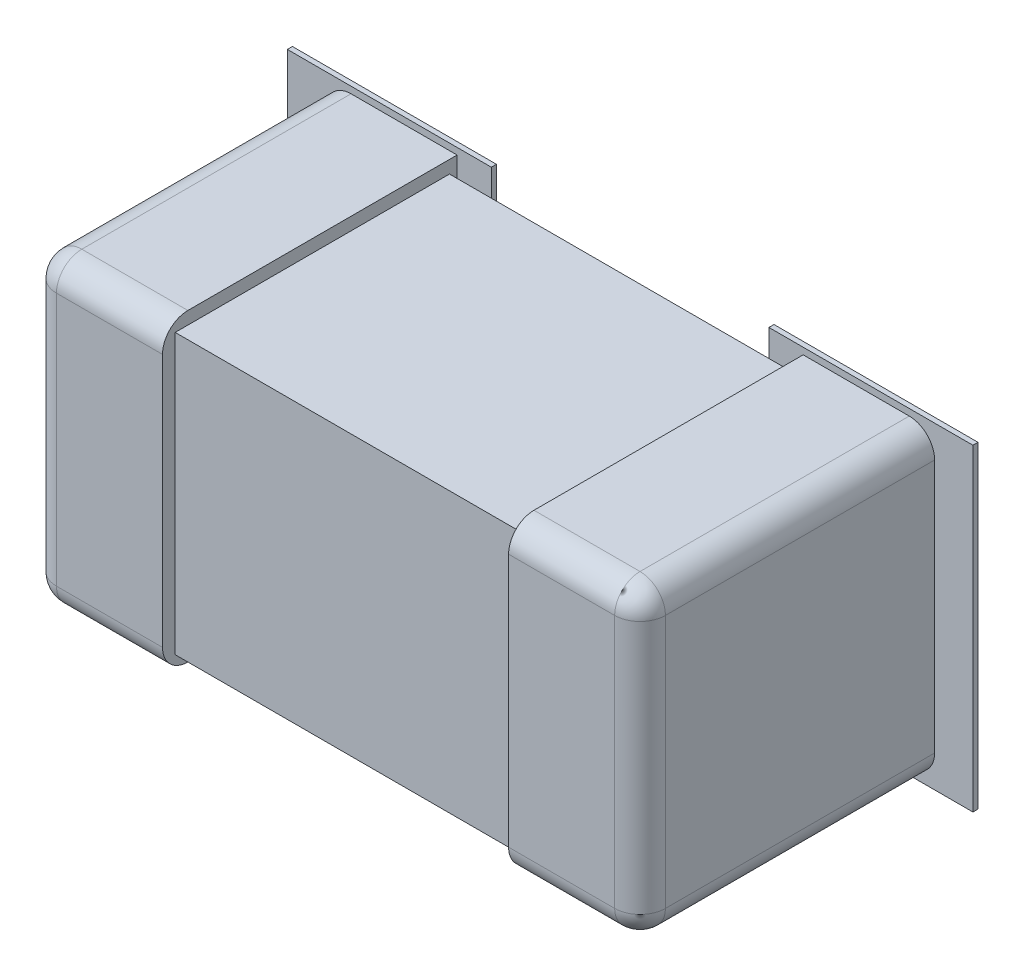
ISO-10303-21;
HEADER;
FILE_DESCRIPTION(('STEP AP214'),'2;1');
FILE_NAME('part.step','',(''),(''),'','','');
FILE_SCHEMA(('AUTOMOTIVE_DESIGN { 1 0 10303 214 1 1 1 1 }'));
ENDSEC;
DATA;
#1=APPLICATION_CONTEXT('core data for automotive mechanical design processes');
#2=APPLICATION_PROTOCOL_DEFINITION('international standard','automotive_design',2000,#1);
#3=PRODUCT_CONTEXT('',#1,'mechanical');
#4=PRODUCT('Part','Part','',(#3));
#5=PRODUCT_RELATED_PRODUCT_CATEGORY('part','',(#4));
#6=PRODUCT_DEFINITION_FORMATION('','',#4);
#7=PRODUCT_DEFINITION_CONTEXT('part definition',#1,'design');
#8=PRODUCT_DEFINITION('design','',#6,#7);
#9=PRODUCT_DEFINITION_SHAPE('','',#8);
#10=(LENGTH_UNIT() NAMED_UNIT(*) SI_UNIT(.MILLI.,.METRE.));
#11=(NAMED_UNIT(*) PLANE_ANGLE_UNIT() SI_UNIT($,.RADIAN.));
#12=(NAMED_UNIT(*) SI_UNIT($,.STERADIAN.) SOLID_ANGLE_UNIT());
#13=UNCERTAINTY_MEASURE_WITH_UNIT(LENGTH_MEASURE(1.E-05),#10,'distance_accuracy_value','');
#14=(GEOMETRIC_REPRESENTATION_CONTEXT(3) GLOBAL_UNCERTAINTY_ASSIGNED_CONTEXT((#13)) GLOBAL_UNIT_ASSIGNED_CONTEXT((#10,
#11,#12)) REPRESENTATION_CONTEXT('',''));
#15=CARTESIAN_POINT('',(0.,0.,0.));
#16=DIRECTION('',(0.,0.,1.));
#17=DIRECTION('',(1.,0.,0.));
#18=AXIS2_PLACEMENT_3D('',#15,#16,#17);
#19=CARTESIAN_POINT('',(0.,0.,0.0762));
#20=DIRECTION('',(0.,0.,1.));
#21=DIRECTION('',(1.,0.,0.));
#22=AXIS2_PLACEMENT_3D('',#19,#20,#21);
#23=PLANE('',#22);
#24=DIRECTION('',(1.,0.,0.));
#25=VECTOR('',#24,1.);
#26=CARTESIAN_POINT('',(0.138938,-0.159004,0.0762));
#27=LINE('',#26,#25);
#28=CARTESIAN_POINT('',(0.138938,-0.159004,0.0762));
#29=VERTEX_POINT('',#28);
#30=CARTESIAN_POINT('',(0.343154,-0.159004,0.0762));
#31=VERTEX_POINT('',#30);
#32=EDGE_CURVE('E331',#29,#31,#27,.T.);
#33=ORIENTED_EDGE('',*,*,#32,.F.);
#34=DIRECTION('',(0.,1.,0.));
#35=VECTOR('',#34,1.);
#36=CARTESIAN_POINT('',(0.138938,0.159004,0.0762));
#37=LINE('',#36,#35);
#38=CARTESIAN_POINT('',(0.138938,0.159004,0.0762));
#39=VERTEX_POINT('',#38);
#40=EDGE_CURVE('E336',#39,#29,#37,.F.);
#41=ORIENTED_EDGE('',*,*,#40,.F.);
#42=DIRECTION('',(1.,0.,0.));
#43=VECTOR('',#42,1.);
#44=CARTESIAN_POINT('',(0.343154,0.159004,0.0762));
#45=LINE('',#44,#43);
#46=CARTESIAN_POINT('',(0.343154,0.159004,0.0762));
#47=VERTEX_POINT('',#46);
#48=EDGE_CURVE('E320',#47,#39,#45,.F.);
#49=ORIENTED_EDGE('',*,*,#48,.F.);
#50=DIRECTION('',(0.,1.,0.));
#51=VECTOR('',#50,1.);
#52=CARTESIAN_POINT('',(0.343154,-0.159004,0.0762));
#53=LINE('',#52,#51);
#54=EDGE_CURVE('E96',#31,#47,#53,.T.);
#55=ORIENTED_EDGE('',*,*,#54,.F.);
#56=EDGE_LOOP('',(#33,#41,#49,#55));
#57=FACE_BOUND('',#56,.T.);
#58=ADVANCED_FACE('F17',(#57),#23,.F.);
#59=CARTESIAN_POINT('',(0.,0.,0.0762));
#60=DIRECTION('',(0.,0.,1.));
#61=DIRECTION('',(1.,0.,0.));
#62=AXIS2_PLACEMENT_3D('',#59,#60,#61);
#63=PLANE('',#62);
#64=DIRECTION('',(1.,0.,0.));
#65=VECTOR('',#64,1.);
#66=CARTESIAN_POINT('',(-0.138938,0.159004,0.0762));
#67=LINE('',#66,#65);
#68=CARTESIAN_POINT('',(-0.138938,0.159004,0.0762));
#69=VERTEX_POINT('',#68);
#70=CARTESIAN_POINT('',(-0.343154,0.159004,0.0762));
#71=VERTEX_POINT('',#70);
#72=EDGE_CURVE('E279',#69,#71,#67,.F.);
#73=ORIENTED_EDGE('',*,*,#72,.F.);
#74=DIRECTION('',(0.,1.,0.));
#75=VECTOR('',#74,1.);
#76=CARTESIAN_POINT('',(-0.138938,-0.159004,0.0762));
#77=LINE('',#76,#75);
#78=CARTESIAN_POINT('',(-0.138938,-0.159004,0.0762));
#79=VERTEX_POINT('',#78);
#80=EDGE_CURVE('E285',#79,#69,#77,.T.);
#81=ORIENTED_EDGE('',*,*,#80,.F.);
#82=DIRECTION('',(1.,0.,0.));
#83=VECTOR('',#82,1.);
#84=CARTESIAN_POINT('',(-0.343154,-0.159004,0.0762));
#85=LINE('',#84,#83);
#86=CARTESIAN_POINT('',(-0.343154,-0.159004,0.0762));
#87=VERTEX_POINT('',#86);
#88=EDGE_CURVE('E264',#87,#79,#85,.T.);
#89=ORIENTED_EDGE('',*,*,#88,.F.);
#90=DIRECTION('',(0.,1.,0.));
#91=VECTOR('',#90,1.);
#92=CARTESIAN_POINT('',(-0.343154,0.159004,0.0762));
#93=LINE('',#92,#91);
#94=EDGE_CURVE('E273',#71,#87,#93,.F.);
#95=ORIENTED_EDGE('',*,*,#94,.F.);
#96=EDGE_LOOP('',(#73,#81,#89,#95));
#97=FACE_BOUND('',#96,.T.);
#98=ADVANCED_FACE('F657',(#97),#63,.F.);
#99=CARTESIAN_POINT('',(0.138938,0.159004,0.0762));
#100=DIRECTION('',(-1.,0.,0.));
#101=DIRECTION('',(0.,0.,1.));
#102=AXIS2_PLACEMENT_3D('',#99,#100,#101);
#103=PLANE('',#102);
#104=DIRECTION('',(0.,0.,1.));
#105=VECTOR('',#104,1.);
#106=CARTESIAN_POINT('',(0.138938,0.159004,0.0762));
#107=LINE('',#106,#105);
#108=CARTESIAN_POINT('',(0.138938,0.159004,0.08128));
#109=VERTEX_POINT('',#108);
#110=EDGE_CURVE('E325',#39,#109,#107,.T.);
#111=ORIENTED_EDGE('',*,*,#110,.F.);
#112=ORIENTED_EDGE('',*,*,#40,.T.);
#113=DIRECTION('',(0.,0.,-1.));
#114=VECTOR('',#113,1.);
#115=CARTESIAN_POINT('',(0.138938,-0.159004,0.0762));
#116=LINE('',#115,#114);
#117=CARTESIAN_POINT('',(0.138938,-0.159004,0.08128));
#118=VERTEX_POINT('',#117);
#119=EDGE_CURVE('E333',#118,#29,#116,.T.);
#120=ORIENTED_EDGE('',*,*,#119,.F.);
#121=DIRECTION('',(0.,1.,0.));
#122=VECTOR('',#121,1.);
#123=CARTESIAN_POINT('',(0.138938,0.,0.08128));
#124=LINE('',#123,#122);
#125=EDGE_CURVE('E217',#109,#118,#124,.F.);
#126=ORIENTED_EDGE('',*,*,#125,.F.);
#127=EDGE_LOOP('',(#111,#112,#120,#126));
#128=FACE_BOUND('',#127,.T.);
#129=ADVANCED_FACE('F663',(#128),#103,.T.);
#130=CARTESIAN_POINT('',(0.138938,-0.159004,0.0762));
#131=DIRECTION('',(0.,-1.,0.));
#132=DIRECTION('',(0.,0.,-1.));
#133=AXIS2_PLACEMENT_3D('',#130,#131,#132);
#134=PLANE('',#133);
#135=ORIENTED_EDGE('',*,*,#119,.T.);
#136=ORIENTED_EDGE('',*,*,#32,.T.);
#137=DIRECTION('',(0.,0.,-1.));
#138=VECTOR('',#137,1.);
#139=CARTESIAN_POINT('',(0.343154,-0.159004,0.0762));
#140=LINE('',#139,#138);
#141=CARTESIAN_POINT('',(0.343154,-0.159004,0.08128));
#142=VERTEX_POINT('',#141);
#143=EDGE_CURVE('E329',#142,#31,#140,.T.);
#144=ORIENTED_EDGE('',*,*,#143,.F.);
#145=DIRECTION('',(1.,0.,0.));
#146=VECTOR('',#145,1.);
#147=CARTESIAN_POINT('',(0.,-0.159004,0.08128));
#148=LINE('',#147,#146);
#149=EDGE_CURVE('E214',#118,#142,#148,.T.);
#150=ORIENTED_EDGE('',*,*,#149,.F.);
#151=EDGE_LOOP('',(#135,#136,#144,#150));
#152=FACE_BOUND('',#151,.T.);
#153=ADVANCED_FACE('F708',(#152),#134,.T.);
#154=CARTESIAN_POINT('',(0.343154,-0.159004,0.0762));
#155=DIRECTION('',(1.,0.,0.));
#156=DIRECTION('',(0.,0.,-1.));
#157=AXIS2_PLACEMENT_3D('',#154,#155,#156);
#158=PLANE('',#157);
#159=ORIENTED_EDGE('',*,*,#143,.T.);
#160=ORIENTED_EDGE('',*,*,#54,.T.);
#161=DIRECTION('',(0.,0.,1.));
#162=VECTOR('',#161,1.);
#163=CARTESIAN_POINT('',(0.343154,0.159004,0.0762));
#164=LINE('',#163,#162);
#165=CARTESIAN_POINT('',(0.343154,0.159004,0.08128));
#166=VERTEX_POINT('',#165);
#167=EDGE_CURVE('E323',#166,#47,#164,.F.);
#168=ORIENTED_EDGE('',*,*,#167,.F.);
#169=DIRECTION('',(0.,1.,0.));
#170=VECTOR('',#169,1.);
#171=CARTESIAN_POINT('',(0.343154,0.,0.08128));
#172=LINE('',#171,#170);
#173=EDGE_CURVE('E211',#142,#166,#172,.T.);
#174=ORIENTED_EDGE('',*,*,#173,.F.);
#175=EDGE_LOOP('',(#159,#160,#168,#174));
#176=FACE_BOUND('',#175,.T.);
#177=ADVANCED_FACE('F715',(#176),#158,.T.);
#178=CARTESIAN_POINT('',(0.343154,0.159004,0.0762));
#179=DIRECTION('',(0.,1.,0.));
#180=DIRECTION('',(0.,0.,1.));
#181=AXIS2_PLACEMENT_3D('',#178,#179,#180);
#182=PLANE('',#181);
#183=ORIENTED_EDGE('',*,*,#167,.T.);
#184=ORIENTED_EDGE('',*,*,#48,.T.);
#185=ORIENTED_EDGE('',*,*,#110,.T.);
#186=DIRECTION('',(1.,0.,0.));
#187=VECTOR('',#186,1.);
#188=CARTESIAN_POINT('',(0.,0.159004,0.08128));
#189=LINE('',#188,#187);
#190=EDGE_CURVE('E208',#166,#109,#189,.F.);
#191=ORIENTED_EDGE('',*,*,#190,.F.);
#192=EDGE_LOOP('',(#183,#184,#185,#191));
#193=FACE_BOUND('',#192,.T.);
#194=ADVANCED_FACE('F723',(#193),#182,.T.);
#195=CARTESIAN_POINT('',(0.3048,-0.1524,0.0762));
#196=DIRECTION('',(1.,0.,0.));
#197=DIRECTION('',(0.,0.,-1.));
#198=AXIS2_PLACEMENT_3D('',#195,#196,#197);
#199=PLANE('',#198);
#200=DIRECTION('',(0.,0.,-1.));
#201=VECTOR('',#200,1.);
#202=CARTESIAN_POINT('',(0.3048,-0.127,0.7672201064));
#203=LINE('',#202,#201);
#204=CARTESIAN_POINT('',(0.3048,-0.127,0.08128));
#205=VERTEX_POINT('',#204);
#206=CARTESIAN_POINT('',(0.3048,-0.127,0.350774));
#207=VERTEX_POINT('',#206);
#208=EDGE_CURVE('E316',#205,#207,#203,.F.);
#209=ORIENTED_EDGE('',*,*,#208,.F.);
#210=DIRECTION('',(0.,1.,0.));
#211=VECTOR('',#210,1.);
#212=CARTESIAN_POINT('',(0.3048,0.,0.08128));
#213=LINE('',#212,#211);
#214=CARTESIAN_POINT('',(0.3048,0.127,0.08128));
#215=VERTEX_POINT('',#214);
#216=EDGE_CURVE('E206',#215,#205,#213,.F.);
#217=ORIENTED_EDGE('',*,*,#216,.F.);
#218=DIRECTION('',(0.,0.,-1.));
#219=VECTOR('',#218,1.);
#220=CARTESIAN_POINT('',(0.3048,0.127,0.7672201064));
#221=LINE('',#220,#219);
#222=CARTESIAN_POINT('',(0.3048,0.127,0.350774));
#223=VERTEX_POINT('',#222);
#224=EDGE_CURVE('E87',#223,#215,#221,.T.);
#225=ORIENTED_EDGE('',*,*,#224,.F.);
#226=DIRECTION('',(0.,1.,0.));
#227=VECTOR('',#226,1.);
#228=CARTESIAN_POINT('',(0.3048,-0.5735592288,0.350774));
#229=LINE('',#228,#227);
#230=EDGE_CURVE('E342',#207,#223,#229,.T.);
#231=ORIENTED_EDGE('',*,*,#230,.F.);
#232=EDGE_LOOP('',(#209,#217,#225,#231));
#233=FACE_BOUND('',#232,.T.);
#234=ADVANCED_FACE('F730',(#233),#199,.T.);
#235=CARTESIAN_POINT('',(0.2794,0.127,0.7672201064));
#236=DIRECTION('',(0.,0.,-1.));
#237=DIRECTION('',(-1.,0.,0.));
#238=AXIS2_PLACEMENT_3D('',#235,#236,#237);
#239=CYLINDRICAL_SURFACE('',#238,0.0254);
#240=ORIENTED_EDGE('',*,*,#224,.T.);
#241=CARTESIAN_POINT('',(0.2794,0.127,0.08128));
#242=DIRECTION('',(0.,0.,-1.));
#243=DIRECTION('',(-1.,0.,0.));
#244=AXIS2_PLACEMENT_3D('',#241,#242,#243);
#245=CIRCLE('',#244,0.0254);
#246=CARTESIAN_POINT('',(0.2794,0.1524,0.08128));
#247=VERTEX_POINT('',#246);
#248=EDGE_CURVE('E186',#247,#215,#245,.T.);
#249=ORIENTED_EDGE('',*,*,#248,.F.);
#250=DIRECTION('',(0.,0.,1.));
#251=VECTOR('',#250,1.);
#252=CARTESIAN_POINT('',(0.2794,0.1524,0.0762));
#253=LINE('',#252,#251);
#254=CARTESIAN_POINT('',(0.2794,0.1524,0.350774));
#255=VERTEX_POINT('',#254);
#256=EDGE_CURVE('E163',#255,#247,#253,.F.);
#257=ORIENTED_EDGE('',*,*,#256,.F.);
#258=CARTESIAN_POINT('',(0.2794,0.127,0.350774));
#259=DIRECTION('',(0.,0.,-1.));
#260=DIRECTION('',(-1.,0.,0.));
#261=AXIS2_PLACEMENT_3D('',#258,#259,#260);
#262=CIRCLE('',#261,0.0254);
#263=EDGE_CURVE('E20',#223,#255,#262,.F.);
#264=ORIENTED_EDGE('',*,*,#263,.F.);
#265=EDGE_LOOP('',(#240,#249,#257,#264));
#266=FACE_BOUND('',#265,.T.);
#267=ADVANCED_FACE('F184',(#266),#239,.T.);
#268=CARTESIAN_POINT('',(0.2794,0.127,0.350774));
#269=DIRECTION('',(0.,0.707106781186548,0.707106781186548));
#270=DIRECTION('',(1.,0.,0.));
#271=AXIS2_PLACEMENT_3D('',#268,#269,#270);
#272=SPHERICAL_SURFACE('',#271,0.0254);
#273=CARTESIAN_POINT('',(0.2794,0.127,0.350774));
#274=DIRECTION('',(-1.,0.,0.));
#275=DIRECTION('',(0.,0.,1.));
#276=AXIS2_PLACEMENT_3D('',#273,#274,#275);
#277=CIRCLE('',#276,0.0254);
#278=CARTESIAN_POINT('',(0.2794,0.127,0.376174));
#279=VERTEX_POINT('',#278);
#280=CARTESIAN_POINT('',(0.2794,0.144960512242138,0.368734512242138));
#281=VERTEX_POINT('',#280);
#282=EDGE_CURVE('E182',#279,#281,#277,.T.);
#283=ORIENTED_EDGE('',*,*,#282,.F.);
#284=CARTESIAN_POINT('',(0.2794,0.127,0.350774));
#285=DIRECTION('',(0.,1.,0.));
#286=DIRECTION('',(0.,0.,1.));
#287=AXIS2_PLACEMENT_3D('',#284,#285,#286);
#288=CIRCLE('',#287,0.0254);
#289=EDGE_CURVE('E173',#223,#279,#288,.F.);
#290=ORIENTED_EDGE('',*,*,#289,.F.);
#291=ORIENTED_EDGE('',*,*,#263,.T.);
#292=CARTESIAN_POINT('',(0.2794,0.127,0.350774));
#293=DIRECTION('',(-1.,0.,0.));
#294=DIRECTION('',(0.,0.,1.));
#295=AXIS2_PLACEMENT_3D('',#292,#293,#294);
#296=CIRCLE('',#295,0.0254);
#297=EDGE_CURVE('E172',#281,#255,#296,.T.);
#298=ORIENTED_EDGE('',*,*,#297,.F.);
#299=EDGE_LOOP('',(#283,#290,#291,#298));
#300=FACE_BOUND('',#299,.T.);
#301=ADVANCED_FACE('F171',(#300),#272,.T.);
#302=CARTESIAN_POINT('',(0.2794,-0.5735592288,0.350774));
#303=DIRECTION('',(0.,1.,0.));
#304=DIRECTION('',(0.,0.,1.));
#305=AXIS2_PLACEMENT_3D('',#302,#303,#304);
#306=CYLINDRICAL_SURFACE('',#305,0.0254);
#307=CARTESIAN_POINT('',(0.2794,-0.127,0.350774));
#308=DIRECTION('',(0.,1.,0.));
#309=DIRECTION('',(0.,0.,1.));
#310=AXIS2_PLACEMENT_3D('',#307,#308,#309);
#311=CIRCLE('',#310,0.0254);
#312=CARTESIAN_POINT('',(0.297360512242138,-0.127,0.368734512242138));
#313=VERTEX_POINT('',#312);
#314=EDGE_CURVE('E344',#207,#313,#311,.F.);
#315=ORIENTED_EDGE('',*,*,#314,.F.);
#316=ORIENTED_EDGE('',*,*,#230,.T.);
#317=ORIENTED_EDGE('',*,*,#289,.T.);
#318=DIRECTION('',(0.,1.,0.));
#319=VECTOR('',#318,1.);
#320=CARTESIAN_POINT('',(0.2794,0.,0.376174));
#321=LINE('',#320,#319);
#322=CARTESIAN_POINT('',(0.2794,-0.127,0.376174));
#323=VERTEX_POINT('',#322);
#324=EDGE_CURVE('E195',#323,#279,#321,.T.);
#325=ORIENTED_EDGE('',*,*,#324,.F.);
#326=CARTESIAN_POINT('',(0.2794,-0.127,0.350774));
#327=DIRECTION('',(0.,-1.,0.));
#328=DIRECTION('',(0.707106781186548,0.,0.707106781186548));
#329=AXIS2_PLACEMENT_3D('',#326,#327,#328);
#330=CIRCLE('',#329,0.0254);
#331=EDGE_CURVE('E296',#313,#323,#330,.T.);
#332=ORIENTED_EDGE('',*,*,#331,.F.);
#333=EDGE_LOOP('',(#315,#316,#317,#325,#332));
#334=FACE_BOUND('',#333,.T.);
#335=ADVANCED_FACE('F304',(#334),#306,.T.);
#336=CARTESIAN_POINT('',(0.2794,-0.127,0.350774));
#337=DIRECTION('',(0.707106781186548,0.,0.707106781186548));
#338=DIRECTION('',(0.,-1.,0.));
#339=AXIS2_PLACEMENT_3D('',#336,#337,#338);
#340=SPHERICAL_SURFACE('',#339,0.0254);
#341=ORIENTED_EDGE('',*,*,#331,.T.);
#342=CARTESIAN_POINT('',(0.2794,-0.127,0.350774));
#343=DIRECTION('',(1.,0.,0.));
#344=DIRECTION('',(0.,0.,-1.));
#345=AXIS2_PLACEMENT_3D('',#342,#343,#344);
#346=CIRCLE('',#345,0.0254);
#347=CARTESIAN_POINT('',(0.2794,-0.1524,0.350774));
#348=VERTEX_POINT('',#347);
#349=EDGE_CURVE('E374',#348,#323,#346,.F.);
#350=ORIENTED_EDGE('',*,*,#349,.F.);
#351=CARTESIAN_POINT('',(0.2794,-0.127,0.350774));
#352=DIRECTION('',(0.,0.,-1.));
#353=DIRECTION('',(-1.,0.,0.));
#354=AXIS2_PLACEMENT_3D('',#351,#352,#353);
#355=CIRCLE('',#354,0.0254);
#356=EDGE_CURVE('E288',#207,#348,#355,.T.);
#357=ORIENTED_EDGE('',*,*,#356,.F.);
#358=ORIENTED_EDGE('',*,*,#314,.T.);
#359=EDGE_LOOP('',(#341,#350,#357,#358));
#360=FACE_BOUND('',#359,.T.);
#361=ADVANCED_FACE('F299',(#360),#340,.T.);
#362=CARTESIAN_POINT('',(0.2794,-0.127,0.7672201064));
#363=DIRECTION('',(0.,0.,-1.));
#364=DIRECTION('',(-1.,0.,0.));
#365=AXIS2_PLACEMENT_3D('',#362,#363,#364);
#366=CYLINDRICAL_SURFACE('',#365,0.0254);
#367=DIRECTION('',(0.,0.,-1.));
#368=VECTOR('',#367,1.);
#369=CARTESIAN_POINT('',(0.2794,-0.1524,0.0762));
#370=LINE('',#369,#368);
#371=CARTESIAN_POINT('',(0.2794,-0.1524,0.08128));
#372=VERTEX_POINT('',#371);
#373=EDGE_CURVE('E289',#372,#348,#370,.F.);
#374=ORIENTED_EDGE('',*,*,#373,.F.);
#375=CARTESIAN_POINT('',(0.2794,-0.127,0.08128));
#376=DIRECTION('',(0.,0.,-1.));
#377=DIRECTION('',(-1.,0.,0.));
#378=AXIS2_PLACEMENT_3D('',#375,#376,#377);
#379=CIRCLE('',#378,0.0254);
#380=EDGE_CURVE('E189',#205,#372,#379,.T.);
#381=ORIENTED_EDGE('',*,*,#380,.F.);
#382=ORIENTED_EDGE('',*,*,#208,.T.);
#383=ORIENTED_EDGE('',*,*,#356,.T.);
#384=EDGE_LOOP('',(#374,#381,#382,#383));
#385=FACE_BOUND('',#384,.T.);
#386=ADVANCED_FACE('F303',(#385),#366,.T.);
#387=CARTESIAN_POINT('',(-0.138938,-0.159004,0.0762));
#388=DIRECTION('',(1.,0.,0.));
#389=DIRECTION('',(0.,0.,-1.));
#390=AXIS2_PLACEMENT_3D('',#387,#388,#389);
#391=PLANE('',#390);
#392=DIRECTION('',(0.,0.,-1.));
#393=VECTOR('',#392,1.);
#394=CARTESIAN_POINT('',(-0.138938,-0.159004,0.0762));
#395=LINE('',#394,#393);
#396=CARTESIAN_POINT('',(-0.138938,-0.159004,0.08128));
#397=VERTEX_POINT('',#396);
#398=EDGE_CURVE('E270',#79,#397,#395,.F.);
#399=ORIENTED_EDGE('',*,*,#398,.F.);
#400=ORIENTED_EDGE('',*,*,#80,.T.);
#401=DIRECTION('',(0.,0.,1.));
#402=VECTOR('',#401,1.);
#403=CARTESIAN_POINT('',(-0.138938,0.159004,0.0762));
#404=LINE('',#403,#402);
#405=CARTESIAN_POINT('',(-0.138938,0.159004,0.08128));
#406=VERTEX_POINT('',#405);
#407=EDGE_CURVE('E282',#406,#69,#404,.F.);
#408=ORIENTED_EDGE('',*,*,#407,.F.);
#409=DIRECTION('',(0.,1.,0.));
#410=VECTOR('',#409,1.);
#411=CARTESIAN_POINT('',(-0.138938,0.,0.08128));
#412=LINE('',#411,#410);
#413=EDGE_CURVE('E439',#397,#406,#412,.T.);
#414=ORIENTED_EDGE('',*,*,#413,.F.);
#415=EDGE_LOOP('',(#399,#400,#408,#414));
#416=FACE_BOUND('',#415,.T.);
#417=ADVANCED_FACE('F760',(#416),#391,.T.);
#418=CARTESIAN_POINT('',(-0.138938,0.159004,0.0762));
#419=DIRECTION('',(0.,1.,0.));
#420=DIRECTION('',(0.,0.,1.));
#421=AXIS2_PLACEMENT_3D('',#418,#419,#420);
#422=PLANE('',#421);
#423=ORIENTED_EDGE('',*,*,#407,.T.);
#424=ORIENTED_EDGE('',*,*,#72,.T.);
#425=DIRECTION('',(0.,0.,1.));
#426=VECTOR('',#425,1.);
#427=CARTESIAN_POINT('',(-0.343154,0.159004,0.0762));
#428=LINE('',#427,#426);
#429=CARTESIAN_POINT('',(-0.343154,0.159004,0.08128));
#430=VERTEX_POINT('',#429);
#431=EDGE_CURVE('E276',#430,#71,#428,.F.);
#432=ORIENTED_EDGE('',*,*,#431,.F.);
#433=DIRECTION('',(1.,0.,0.));
#434=VECTOR('',#433,1.);
#435=CARTESIAN_POINT('',(0.,0.159004,0.08128));
#436=LINE('',#435,#434);
#437=EDGE_CURVE('E436',#406,#430,#436,.F.);
#438=ORIENTED_EDGE('',*,*,#437,.F.);
#439=EDGE_LOOP('',(#423,#424,#432,#438));
#440=FACE_BOUND('',#439,.T.);
#441=ADVANCED_FACE('F766',(#440),#422,.T.);
#442=CARTESIAN_POINT('',(-0.343154,0.159004,0.0762));
#443=DIRECTION('',(-1.,0.,0.));
#444=DIRECTION('',(0.,0.,1.));
#445=AXIS2_PLACEMENT_3D('',#442,#443,#444);
#446=PLANE('',#445);
#447=ORIENTED_EDGE('',*,*,#431,.T.);
#448=ORIENTED_EDGE('',*,*,#94,.T.);
#449=DIRECTION('',(0.,0.,-1.));
#450=VECTOR('',#449,1.);
#451=CARTESIAN_POINT('',(-0.343154,-0.159004,0.0762));
#452=LINE('',#451,#450);
#453=CARTESIAN_POINT('',(-0.343154,-0.159004,0.08128));
#454=VERTEX_POINT('',#453);
#455=EDGE_CURVE('E267',#454,#87,#452,.T.);
#456=ORIENTED_EDGE('',*,*,#455,.F.);
#457=DIRECTION('',(0.,1.,0.));
#458=VECTOR('',#457,1.);
#459=CARTESIAN_POINT('',(-0.343154,0.,0.08128));
#460=LINE('',#459,#458);
#461=EDGE_CURVE('E433',#430,#454,#460,.F.);
#462=ORIENTED_EDGE('',*,*,#461,.F.);
#463=EDGE_LOOP('',(#447,#448,#456,#462));
#464=FACE_BOUND('',#463,.T.);
#465=ADVANCED_FACE('F773',(#464),#446,.T.);
#466=CARTESIAN_POINT('',(-0.343154,-0.159004,0.0762));
#467=DIRECTION('',(0.,-1.,0.));
#468=DIRECTION('',(0.,0.,-1.));
#469=AXIS2_PLACEMENT_3D('',#466,#467,#468);
#470=PLANE('',#469);
#471=ORIENTED_EDGE('',*,*,#455,.T.);
#472=ORIENTED_EDGE('',*,*,#88,.T.);
#473=ORIENTED_EDGE('',*,*,#398,.T.);
#474=DIRECTION('',(1.,0.,0.));
#475=VECTOR('',#474,1.);
#476=CARTESIAN_POINT('',(0.,-0.159004,0.08128));
#477=LINE('',#476,#475);
#478=EDGE_CURVE('E373',#454,#397,#477,.T.);
#479=ORIENTED_EDGE('',*,*,#478,.F.);
#480=EDGE_LOOP('',(#471,#472,#473,#479));
#481=FACE_BOUND('',#480,.T.);
#482=ADVANCED_FACE('F781',(#481),#470,.T.);
#483=CARTESIAN_POINT('',(-0.3048,0.1524,0.0762));
#484=DIRECTION('',(-1.,0.,0.));
#485=DIRECTION('',(0.,0.,1.));
#486=AXIS2_PLACEMENT_3D('',#483,#484,#485);
#487=PLANE('',#486);
#488=DIRECTION('',(0.,0.,-1.));
#489=VECTOR('',#488,1.);
#490=CARTESIAN_POINT('',(-0.3048,0.127,0.7672201064));
#491=LINE('',#490,#489);
#492=CARTESIAN_POINT('',(-0.3048,0.127,0.08128));
#493=VERTEX_POINT('',#492);
#494=CARTESIAN_POINT('',(-0.3048,0.127,0.350774));
#495=VERTEX_POINT('',#494);
#496=EDGE_CURVE('E227',#493,#495,#491,.F.);
#497=ORIENTED_EDGE('',*,*,#496,.F.);
#498=DIRECTION('',(0.,1.,0.));
#499=VECTOR('',#498,1.);
#500=CARTESIAN_POINT('',(-0.3048,0.,0.08128));
#501=LINE('',#500,#499);
#502=CARTESIAN_POINT('',(-0.3048,-0.127,0.08128));
#503=VERTEX_POINT('',#502);
#504=EDGE_CURVE('E369',#503,#493,#501,.T.);
#505=ORIENTED_EDGE('',*,*,#504,.F.);
#506=DIRECTION('',(0.,0.,-1.));
#507=VECTOR('',#506,1.);
#508=CARTESIAN_POINT('',(-0.3048,-0.127,0.7672201064));
#509=LINE('',#508,#507);
#510=CARTESIAN_POINT('',(-0.3048,-0.127,0.350774));
#511=VERTEX_POINT('',#510);
#512=EDGE_CURVE('E261',#511,#503,#509,.T.);
#513=ORIENTED_EDGE('',*,*,#512,.F.);
#514=DIRECTION('',(0.,-1.,0.));
#515=VECTOR('',#514,1.);
#516=CARTESIAN_POINT('',(-0.3048,0.5735592288,0.350774));
#517=LINE('',#516,#515);
#518=EDGE_CURVE('E338',#495,#511,#517,.T.);
#519=ORIENTED_EDGE('',*,*,#518,.F.);
#520=EDGE_LOOP('',(#497,#505,#513,#519));
#521=FACE_BOUND('',#520,.T.);
#522=ADVANCED_FACE('F789',(#521),#487,.T.);
#523=CARTESIAN_POINT('',(-0.2794,-0.127,0.7672201064));
#524=DIRECTION('',(0.,0.,-1.));
#525=DIRECTION('',(-1.,0.,0.));
#526=AXIS2_PLACEMENT_3D('',#523,#524,#525);
#527=CYLINDRICAL_SURFACE('',#526,0.0254);
#528=ORIENTED_EDGE('',*,*,#512,.T.);
#529=CARTESIAN_POINT('',(-0.2794,-0.127,0.08128));
#530=DIRECTION('',(0.,0.,-1.));
#531=DIRECTION('',(-1.,0.,0.));
#532=AXIS2_PLACEMENT_3D('',#529,#530,#531);
#533=CIRCLE('',#532,0.0254);
#534=CARTESIAN_POINT('',(-0.2794,-0.1524,0.08128));
#535=VERTEX_POINT('',#534);
#536=EDGE_CURVE('E370',#535,#503,#533,.T.);
#537=ORIENTED_EDGE('',*,*,#536,.F.);
#538=DIRECTION('',(0.,0.,-1.));
#539=VECTOR('',#538,1.);
#540=CARTESIAN_POINT('',(-0.2794,-0.1524,0.0762));
#541=LINE('',#540,#539);
#542=CARTESIAN_POINT('',(-0.2794,-0.1524,0.350774));
#543=VERTEX_POINT('',#542);
#544=EDGE_CURVE('E258',#543,#535,#541,.T.);
#545=ORIENTED_EDGE('',*,*,#544,.F.);
#546=CARTESIAN_POINT('',(-0.2794,-0.127,0.350774));
#547=DIRECTION('',(0.,0.,-1.));
#548=DIRECTION('',(-1.,0.,0.));
#549=AXIS2_PLACEMENT_3D('',#546,#547,#548);
#550=CIRCLE('',#549,0.0254);
#551=EDGE_CURVE('E263',#511,#543,#550,.F.);
#552=ORIENTED_EDGE('',*,*,#551,.F.);
#553=EDGE_LOOP('',(#528,#537,#545,#552));
#554=FACE_BOUND('',#553,.T.);
#555=ADVANCED_FACE('F253',(#554),#527,.T.);
#556=CARTESIAN_POINT('',(-0.2794,-0.127,0.350774));
#557=DIRECTION('',(0.,-0.707106781186548,0.707106781186548));
#558=DIRECTION('',(-1.,0.,0.));
#559=AXIS2_PLACEMENT_3D('',#556,#557,#558);
#560=SPHERICAL_SURFACE('',#559,0.0254);
#561=CARTESIAN_POINT('',(-0.2794,-0.127,0.350774));
#562=DIRECTION('',(1.,0.,0.));
#563=DIRECTION('',(0.,0.,-1.));
#564=AXIS2_PLACEMENT_3D('',#561,#562,#563);
#565=CIRCLE('',#564,0.0254);
#566=CARTESIAN_POINT('',(-0.2794,-0.127,0.376174));
#567=VERTEX_POINT('',#566);
#568=CARTESIAN_POINT('',(-0.2794,-0.144960512242138,0.368734512242138));
#569=VERTEX_POINT('',#568);
#570=EDGE_CURVE('E235',#567,#569,#565,.T.);
#571=ORIENTED_EDGE('',*,*,#570,.F.);
#572=CARTESIAN_POINT('',(-0.2794,-0.127,0.350774));
#573=DIRECTION('',(0.,-1.,0.));
#574=DIRECTION('',(0.,0.,-1.));
#575=AXIS2_PLACEMENT_3D('',#572,#573,#574);
#576=CIRCLE('',#575,0.0254);
#577=EDGE_CURVE('E341',#511,#567,#576,.F.);
#578=ORIENTED_EDGE('',*,*,#577,.F.);
#579=ORIENTED_EDGE('',*,*,#551,.T.);
#580=CARTESIAN_POINT('',(-0.2794,-0.127,0.350774));
#581=DIRECTION('',(1.,0.,0.));
#582=DIRECTION('',(0.,0.,-1.));
#583=AXIS2_PLACEMENT_3D('',#580,#581,#582);
#584=CIRCLE('',#583,0.0254);
#585=EDGE_CURVE('E364',#569,#543,#584,.T.);
#586=ORIENTED_EDGE('',*,*,#585,.F.);
#587=EDGE_LOOP('',(#571,#578,#579,#586));
#588=FACE_BOUND('',#587,.T.);
#589=ADVANCED_FACE('F248',(#588),#560,.T.);
#590=CARTESIAN_POINT('',(-0.2794,0.5735592288,0.350774));
#591=DIRECTION('',(0.,-1.,0.));
#592=DIRECTION('',(0.,0.,-1.));
#593=AXIS2_PLACEMENT_3D('',#590,#591,#592);
#594=CYLINDRICAL_SURFACE('',#593,0.0254);
#595=CARTESIAN_POINT('',(-0.2794,0.127,0.350774));
#596=DIRECTION('',(0.,-1.,0.));
#597=DIRECTION('',(0.,0.,-1.));
#598=AXIS2_PLACEMENT_3D('',#595,#596,#597);
#599=CIRCLE('',#598,0.0254);
#600=CARTESIAN_POINT('',(-0.2794,0.127,0.376174));
#601=VERTEX_POINT('',#600);
#602=EDGE_CURVE('E260',#495,#601,#599,.F.);
#603=ORIENTED_EDGE('',*,*,#602,.F.);
#604=ORIENTED_EDGE('',*,*,#518,.T.);
#605=ORIENTED_EDGE('',*,*,#577,.T.);
#606=DIRECTION('',(0.,1.,0.));
#607=VECTOR('',#606,1.);
#608=CARTESIAN_POINT('',(-0.2794,0.,0.376174));
#609=LINE('',#608,#607);
#610=EDGE_CURVE('E228',#601,#567,#609,.F.);
#611=ORIENTED_EDGE('',*,*,#610,.F.);
#612=EDGE_LOOP('',(#603,#604,#605,#611));
#613=FACE_BOUND('',#612,.T.);
#614=ADVANCED_FACE('F243',(#613),#594,.T.);
#615=CARTESIAN_POINT('',(-0.2794,0.127,0.350774));
#616=DIRECTION('',(-0.707106781186548,0.707106781186548,0.));
#617=DIRECTION('',(0.,0.,1.));
#618=AXIS2_PLACEMENT_3D('',#615,#616,#617);
#619=SPHERICAL_SURFACE('',#618,0.0254);
#620=ORIENTED_EDGE('',*,*,#602,.T.);
#621=CARTESIAN_POINT('',(-0.2794,0.127,0.350774));
#622=DIRECTION('',(-1.,0.,0.));
#623=DIRECTION('',(0.,0.,1.));
#624=AXIS2_PLACEMENT_3D('',#621,#622,#623);
#625=CIRCLE('',#624,0.0254);
#626=CARTESIAN_POINT('',(-0.2794,0.1524,0.350774));
#627=VERTEX_POINT('',#626);
#628=EDGE_CURVE('E361',#627,#601,#625,.F.);
#629=ORIENTED_EDGE('',*,*,#628,.F.);
#630=CARTESIAN_POINT('',(-0.2794,0.127,0.350774));
#631=DIRECTION('',(0.,0.,-1.));
#632=DIRECTION('',(-1.,0.,0.));
#633=AXIS2_PLACEMENT_3D('',#630,#631,#632);
#634=CIRCLE('',#633,0.0254);
#635=CARTESIAN_POINT('',(-0.297360512242138,0.144960512242138,0.350774));
#636=VERTEX_POINT('',#635);
#637=EDGE_CURVE('E220',#636,#627,#634,.T.);
#638=ORIENTED_EDGE('',*,*,#637,.F.);
#639=CARTESIAN_POINT('',(-0.2794,0.127,0.350774));
#640=DIRECTION('',(0.,0.,-1.));
#641=DIRECTION('',(-1.,0.,0.));
#642=AXIS2_PLACEMENT_3D('',#639,#640,#641);
#643=CIRCLE('',#642,0.0254);
#644=EDGE_CURVE('E35',#495,#636,#643,.T.);
#645=ORIENTED_EDGE('',*,*,#644,.F.);
#646=EDGE_LOOP('',(#620,#629,#638,#645));
#647=FACE_BOUND('',#646,.T.);
#648=ADVANCED_FACE('F238',(#647),#619,.T.);
#649=CARTESIAN_POINT('',(-0.2794,0.127,0.7672201064));
#650=DIRECTION('',(0.,0.,-1.));
#651=DIRECTION('',(-1.,0.,0.));
#652=AXIS2_PLACEMENT_3D('',#649,#650,#651);
#653=CYLINDRICAL_SURFACE('',#652,0.0254);
#654=DIRECTION('',(0.,0.,1.));
#655=VECTOR('',#654,1.);
#656=CARTESIAN_POINT('',(-0.2794,0.1524,0.0762));
#657=LINE('',#656,#655);
#658=CARTESIAN_POINT('',(-0.2794,0.1524,0.08128));
#659=VERTEX_POINT('',#658);
#660=EDGE_CURVE('E221',#659,#627,#657,.T.);
#661=ORIENTED_EDGE('',*,*,#660,.F.);
#662=CARTESIAN_POINT('',(-0.2794,0.127,0.08128));
#663=DIRECTION('',(0.,0.,-1.));
#664=DIRECTION('',(-1.,0.,0.));
#665=AXIS2_PLACEMENT_3D('',#662,#663,#664);
#666=CIRCLE('',#665,0.0254);
#667=EDGE_CURVE('E367',#493,#659,#666,.T.);
#668=ORIENTED_EDGE('',*,*,#667,.F.);
#669=ORIENTED_EDGE('',*,*,#496,.T.);
#670=ORIENTED_EDGE('',*,*,#644,.T.);
#671=ORIENTED_EDGE('',*,*,#637,.T.);
#672=EDGE_LOOP('',(#661,#668,#669,#670,#671));
#673=FACE_BOUND('',#672,.T.);
#674=ADVANCED_FACE('F242',(#673),#653,.T.);
#675=CARTESIAN_POINT('',(0.,0.,0.08128));
#676=DIRECTION('',(0.,0.,1.));
#677=DIRECTION('',(1.,0.,0.));
#678=AXIS2_PLACEMENT_3D('',#675,#676,#677);
#679=PLANE('',#678);
#680=DIRECTION('',(0.,1.,0.));
#681=VECTOR('',#680,1.);
#682=CARTESIAN_POINT('',(0.173228,-0.1524,0.08128));
#683=LINE('',#682,#681);
#684=CARTESIAN_POINT('',(0.173228,-0.1524,0.08128));
#685=VERTEX_POINT('',#684);
#686=CARTESIAN_POINT('',(0.173228,0.1524,0.08128));
#687=VERTEX_POINT('',#686);
#688=EDGE_CURVE('E404',#685,#687,#683,.T.);
#689=ORIENTED_EDGE('',*,*,#688,.T.);
#690=DIRECTION('',(1.,0.,0.));
#691=VECTOR('',#690,1.);
#692=CARTESIAN_POINT('',(0.3048,0.1524,0.08128));
#693=LINE('',#692,#691);
#694=EDGE_CURVE('E188',#247,#687,#693,.F.);
#695=ORIENTED_EDGE('',*,*,#694,.F.);
#696=ORIENTED_EDGE('',*,*,#248,.T.);
#697=ORIENTED_EDGE('',*,*,#216,.T.);
#698=ORIENTED_EDGE('',*,*,#380,.T.);
#699=DIRECTION('',(1.,0.,0.));
#700=VECTOR('',#699,1.);
#701=CARTESIAN_POINT('',(-0.3048,-0.1524,0.08128));
#702=LINE('',#701,#700);
#703=EDGE_CURVE('E442',#685,#372,#702,.T.);
#704=ORIENTED_EDGE('',*,*,#703,.F.);
#705=EDGE_LOOP('',(#689,#695,#696,#697,#698,#704));
#706=FACE_BOUND('',#705,.T.);
#707=ORIENTED_EDGE('',*,*,#173,.T.);
#708=ORIENTED_EDGE('',*,*,#190,.T.);
#709=ORIENTED_EDGE('',*,*,#125,.T.);
#710=ORIENTED_EDGE('',*,*,#149,.T.);
#711=EDGE_LOOP('',(#707,#708,#709,#710));
#712=FACE_BOUND('',#711,.T.);
#713=ADVANCED_FACE('F464',(#706,#712),#679,.T.);
#714=CARTESIAN_POINT('',(0.3048,0.1524,0.0762));
#715=DIRECTION('',(0.,1.,0.));
#716=DIRECTION('',(0.,0.,1.));
#717=AXIS2_PLACEMENT_3D('',#714,#715,#716);
#718=PLANE('',#717);
#719=ORIENTED_EDGE('',*,*,#256,.T.);
#720=ORIENTED_EDGE('',*,*,#694,.T.);
#721=DIRECTION('',(0.,0.,-1.));
#722=VECTOR('',#721,1.);
#723=CARTESIAN_POINT('',(0.173228,0.1524,0.0889));
#724=LINE('',#723,#722);
#725=CARTESIAN_POINT('',(0.173228,0.1524,0.350774));
#726=VERTEX_POINT('',#725);
#727=EDGE_CURVE('E194',#687,#726,#724,.F.);
#728=ORIENTED_EDGE('',*,*,#727,.T.);
#729=DIRECTION('',(-1.,0.,0.));
#730=VECTOR('',#729,1.);
#731=CARTESIAN_POINT('',(1.2378251088,0.1524,0.350774));
#732=LINE('',#731,#730);
#733=EDGE_CURVE('E179',#255,#726,#732,.T.);
#734=ORIENTED_EDGE('',*,*,#733,.F.);
#735=EDGE_LOOP('',(#719,#720,#728,#734));
#736=FACE_BOUND('',#735,.T.);
#737=ADVANCED_FACE('F192',(#736),#718,.T.);
#738=CARTESIAN_POINT('',(1.2378251088,0.127,0.350774));
#739=DIRECTION('',(-1.,0.,0.));
#740=DIRECTION('',(0.,0.,1.));
#741=AXIS2_PLACEMENT_3D('',#738,#739,#740);
#742=CYLINDRICAL_SURFACE('',#741,0.0254);
#743=ORIENTED_EDGE('',*,*,#733,.T.);
#744=CARTESIAN_POINT('',(0.173228,0.127,0.350774));
#745=DIRECTION('',(-1.,0.,0.));
#746=DIRECTION('',(0.,0.,1.));
#747=AXIS2_PLACEMENT_3D('',#744,#745,#746);
#748=CIRCLE('',#747,0.0254);
#749=CARTESIAN_POINT('',(0.173228,0.127,0.376174));
#750=VERTEX_POINT('',#749);
#751=EDGE_CURVE('E359',#726,#750,#748,.F.);
#752=ORIENTED_EDGE('',*,*,#751,.T.);
#753=DIRECTION('',(1.,0.,0.));
#754=VECTOR('',#753,1.);
#755=CARTESIAN_POINT('',(0.,0.127,0.376174));
#756=LINE('',#755,#754);
#757=EDGE_CURVE('E198',#279,#750,#756,.F.);
#758=ORIENTED_EDGE('',*,*,#757,.F.);
#759=ORIENTED_EDGE('',*,*,#282,.T.);
#760=ORIENTED_EDGE('',*,*,#297,.T.);
#761=EDGE_LOOP('',(#743,#752,#758,#759,#760));
#762=FACE_BOUND('',#761,.T.);
#763=ADVANCED_FACE('F177',(#762),#742,.T.);
#764=CARTESIAN_POINT('',(0.,0.,0.376174));
#765=DIRECTION('',(0.,0.,1.));
#766=DIRECTION('',(1.,0.,0.));
#767=AXIS2_PLACEMENT_3D('',#764,#765,#766);
#768=PLANE('',#767);
#769=ORIENTED_EDGE('',*,*,#324,.T.);
#770=ORIENTED_EDGE('',*,*,#757,.T.);
#771=DIRECTION('',(0.,1.,0.));
#772=VECTOR('',#771,1.);
#773=CARTESIAN_POINT('',(0.173228,-0.1524,0.376174));
#774=LINE('',#773,#772);
#775=CARTESIAN_POINT('',(0.173228,-0.127,0.376174));
#776=VERTEX_POINT('',#775);
#777=EDGE_CURVE('E358',#750,#776,#774,.F.);
#778=ORIENTED_EDGE('',*,*,#777,.T.);
#779=DIRECTION('',(1.,0.,0.));
#780=VECTOR('',#779,1.);
#781=CARTESIAN_POINT('',(-1.2378251088,-0.127,0.376174));
#782=LINE('',#781,#780);
#783=EDGE_CURVE('E292',#323,#776,#782,.F.);
#784=ORIENTED_EDGE('',*,*,#783,.F.);
#785=EDGE_LOOP('',(#769,#770,#778,#784));
#786=FACE_BOUND('',#785,.T.);
#787=ADVANCED_FACE('F389',(#786),#768,.T.);
#788=CARTESIAN_POINT('',(-1.2378251088,-0.127,0.350774));
#789=DIRECTION('',(1.,0.,0.));
#790=DIRECTION('',(0.,0.,-1.));
#791=AXIS2_PLACEMENT_3D('',#788,#789,#790);
#792=CYLINDRICAL_SURFACE('',#791,0.0254);
#793=ORIENTED_EDGE('',*,*,#783,.T.);
#794=CARTESIAN_POINT('',(0.173228,-0.127,0.350774));
#795=DIRECTION('',(1.,0.,0.));
#796=DIRECTION('',(0.,0.,-1.));
#797=AXIS2_PLACEMENT_3D('',#794,#795,#796);
#798=CIRCLE('',#797,0.0254);
#799=CARTESIAN_POINT('',(0.173228,-0.1524,0.350774));
#800=VERTEX_POINT('',#799);
#801=EDGE_CURVE('E354',#776,#800,#798,.T.);
#802=ORIENTED_EDGE('',*,*,#801,.T.);
#803=DIRECTION('',(1.,0.,0.));
#804=VECTOR('',#803,1.);
#805=CARTESIAN_POINT('',(-0.3048,-0.1524,0.350774));
#806=LINE('',#805,#804);
#807=EDGE_CURVE('E291',#348,#800,#806,.F.);
#808=ORIENTED_EDGE('',*,*,#807,.F.);
#809=ORIENTED_EDGE('',*,*,#349,.T.);
#810=EDGE_LOOP('',(#793,#802,#808,#809));
#811=FACE_BOUND('',#810,.T.);
#812=ADVANCED_FACE('F451',(#811),#792,.T.);
#813=CARTESIAN_POINT('',(-0.3048,-0.1524,0.0762));
#814=DIRECTION('',(0.,-1.,0.));
#815=DIRECTION('',(0.,0.,-1.));
#816=AXIS2_PLACEMENT_3D('',#813,#814,#815);
#817=PLANE('',#816);
#818=DIRECTION('',(0.,0.,-1.));
#819=VECTOR('',#818,1.);
#820=CARTESIAN_POINT('',(0.173228,-0.1524,0.0889));
#821=LINE('',#820,#819);
#822=EDGE_CURVE('E357',#800,#685,#821,.T.);
#823=ORIENTED_EDGE('',*,*,#822,.T.);
#824=ORIENTED_EDGE('',*,*,#703,.T.);
#825=ORIENTED_EDGE('',*,*,#373,.T.);
#826=ORIENTED_EDGE('',*,*,#807,.T.);
#827=EDGE_LOOP('',(#823,#824,#825,#826));
#828=FACE_BOUND('',#827,.T.);
#829=ADVANCED_FACE('F461',(#828),#817,.T.);
#830=CARTESIAN_POINT('',(0.,0.,0.08128));
#831=DIRECTION('',(0.,0.,1.));
#832=DIRECTION('',(1.,0.,0.));
#833=AXIS2_PLACEMENT_3D('',#830,#831,#832);
#834=PLANE('',#833);
#835=DIRECTION('',(0.,1.,0.));
#836=VECTOR('',#835,1.);
#837=CARTESIAN_POINT('',(-0.173228,-0.1524,0.08128));
#838=LINE('',#837,#836);
#839=CARTESIAN_POINT('',(-0.173228,0.1524,0.08128));
#840=VERTEX_POINT('',#839);
#841=CARTESIAN_POINT('',(-0.173228,-0.1524,0.08128));
#842=VERTEX_POINT('',#841);
#843=EDGE_CURVE('E416',#840,#842,#838,.F.);
#844=ORIENTED_EDGE('',*,*,#843,.T.);
#845=DIRECTION('',(1.,0.,0.));
#846=VECTOR('',#845,1.);
#847=CARTESIAN_POINT('',(-0.3048,-0.1524,0.08128));
#848=LINE('',#847,#846);
#849=EDGE_CURVE('E425',#535,#842,#848,.T.);
#850=ORIENTED_EDGE('',*,*,#849,.F.);
#851=ORIENTED_EDGE('',*,*,#536,.T.);
#852=ORIENTED_EDGE('',*,*,#504,.T.);
#853=ORIENTED_EDGE('',*,*,#667,.T.);
#854=DIRECTION('',(1.,0.,0.));
#855=VECTOR('',#854,1.);
#856=CARTESIAN_POINT('',(0.3048,0.1524,0.08128));
#857=LINE('',#856,#855);
#858=EDGE_CURVE('E410',#840,#659,#857,.F.);
#859=ORIENTED_EDGE('',*,*,#858,.F.);
#860=EDGE_LOOP('',(#844,#850,#851,#852,#853,#859));
#861=FACE_BOUND('',#860,.T.);
#862=ORIENTED_EDGE('',*,*,#461,.T.);
#863=ORIENTED_EDGE('',*,*,#478,.T.);
#864=ORIENTED_EDGE('',*,*,#413,.T.);
#865=ORIENTED_EDGE('',*,*,#437,.T.);
#866=EDGE_LOOP('',(#862,#863,#864,#865));
#867=FACE_BOUND('',#866,.T.);
#868=ADVANCED_FACE('F629',(#861,#867),#834,.T.);
#869=CARTESIAN_POINT('',(-0.3048,-0.1524,0.0762));
#870=DIRECTION('',(0.,-1.,0.));
#871=DIRECTION('',(0.,0.,-1.));
#872=AXIS2_PLACEMENT_3D('',#869,#870,#871);
#873=PLANE('',#872);
#874=ORIENTED_EDGE('',*,*,#544,.T.);
#875=ORIENTED_EDGE('',*,*,#849,.T.);
#876=DIRECTION('',(0.,0.,1.));
#877=VECTOR('',#876,1.);
#878=CARTESIAN_POINT('',(-0.173228,-0.1524,0.0762));
#879=LINE('',#878,#877);
#880=CARTESIAN_POINT('',(-0.173228,-0.1524,0.350774));
#881=VERTEX_POINT('',#880);
#882=EDGE_CURVE('E353',#842,#881,#879,.T.);
#883=ORIENTED_EDGE('',*,*,#882,.T.);
#884=DIRECTION('',(1.,0.,0.));
#885=VECTOR('',#884,1.);
#886=CARTESIAN_POINT('',(-1.2378251088,-0.1524,0.350774));
#887=LINE('',#886,#885);
#888=EDGE_CURVE('E232',#543,#881,#887,.T.);
#889=ORIENTED_EDGE('',*,*,#888,.F.);
#890=EDGE_LOOP('',(#874,#875,#883,#889));
#891=FACE_BOUND('',#890,.T.);
#892=ADVANCED_FACE('F635',(#891),#873,.T.);
#893=CARTESIAN_POINT('',(-1.2378251088,-0.127,0.350774));
#894=DIRECTION('',(1.,0.,0.));
#895=DIRECTION('',(0.,0.,-1.));
#896=AXIS2_PLACEMENT_3D('',#893,#894,#895);
#897=CYLINDRICAL_SURFACE('',#896,0.0254);
#898=ORIENTED_EDGE('',*,*,#888,.T.);
#899=CARTESIAN_POINT('',(-0.173228,-0.127,0.350774));
#900=DIRECTION('',(1.,0.,0.));
#901=DIRECTION('',(0.,0.,-1.));
#902=AXIS2_PLACEMENT_3D('',#899,#900,#901);
#903=CIRCLE('',#902,0.0254);
#904=CARTESIAN_POINT('',(-0.173228,-0.127,0.376174));
#905=VERTEX_POINT('',#904);
#906=EDGE_CURVE('E350',#881,#905,#903,.F.);
#907=ORIENTED_EDGE('',*,*,#906,.T.);
#908=DIRECTION('',(1.,0.,0.));
#909=VECTOR('',#908,1.);
#910=CARTESIAN_POINT('',(0.,-0.127,0.376174));
#911=LINE('',#910,#909);
#912=EDGE_CURVE('E231',#567,#905,#911,.T.);
#913=ORIENTED_EDGE('',*,*,#912,.F.);
#914=ORIENTED_EDGE('',*,*,#570,.T.);
#915=ORIENTED_EDGE('',*,*,#585,.T.);
#916=EDGE_LOOP('',(#898,#907,#913,#914,#915));
#917=FACE_BOUND('',#916,.T.);
#918=ADVANCED_FACE('F851',(#917),#897,.T.);
#919=CARTESIAN_POINT('',(0.,0.,0.376174));
#920=DIRECTION('',(0.,0.,1.));
#921=DIRECTION('',(1.,0.,0.));
#922=AXIS2_PLACEMENT_3D('',#919,#920,#921);
#923=PLANE('',#922);
#924=ORIENTED_EDGE('',*,*,#610,.T.);
#925=ORIENTED_EDGE('',*,*,#912,.T.);
#926=DIRECTION('',(0.,1.,0.));
#927=VECTOR('',#926,1.);
#928=CARTESIAN_POINT('',(-0.173228,-0.1524,0.376174));
#929=LINE('',#928,#927);
#930=CARTESIAN_POINT('',(-0.173228,0.127,0.376174));
#931=VERTEX_POINT('',#930);
#932=EDGE_CURVE('E349',#905,#931,#929,.T.);
#933=ORIENTED_EDGE('',*,*,#932,.T.);
#934=DIRECTION('',(-1.,0.,0.));
#935=VECTOR('',#934,1.);
#936=CARTESIAN_POINT('',(1.2378251088,0.127,0.376174));
#937=LINE('',#936,#935);
#938=EDGE_CURVE('E225',#601,#931,#937,.F.);
#939=ORIENTED_EDGE('',*,*,#938,.F.);
#940=EDGE_LOOP('',(#924,#925,#933,#939));
#941=FACE_BOUND('',#940,.T.);
#942=ADVANCED_FACE('F858',(#941),#923,.T.);
#943=CARTESIAN_POINT('',(1.2378251088,0.127,0.350774));
#944=DIRECTION('',(-1.,0.,0.));
#945=DIRECTION('',(0.,0.,1.));
#946=AXIS2_PLACEMENT_3D('',#943,#944,#945);
#947=CYLINDRICAL_SURFACE('',#946,0.0254);
#948=ORIENTED_EDGE('',*,*,#938,.T.);
#949=CARTESIAN_POINT('',(-0.173228,0.127,0.350774));
#950=DIRECTION('',(-1.,0.,0.));
#951=DIRECTION('',(0.,0.,1.));
#952=AXIS2_PLACEMENT_3D('',#949,#950,#951);
#953=CIRCLE('',#952,0.0254);
#954=CARTESIAN_POINT('',(-0.173228,0.1524,0.350774));
#955=VERTEX_POINT('',#954);
#956=EDGE_CURVE('E345',#931,#955,#953,.T.);
#957=ORIENTED_EDGE('',*,*,#956,.T.);
#958=DIRECTION('',(1.,0.,0.));
#959=VECTOR('',#958,1.);
#960=CARTESIAN_POINT('',(0.3048,0.1524,0.350774));
#961=LINE('',#960,#959);
#962=EDGE_CURVE('E224',#627,#955,#961,.T.);
#963=ORIENTED_EDGE('',*,*,#962,.F.);
#964=ORIENTED_EDGE('',*,*,#628,.T.);
#965=EDGE_LOOP('',(#948,#957,#963,#964));
#966=FACE_BOUND('',#965,.T.);
#967=ADVANCED_FACE('F866',(#966),#947,.T.);
#968=CARTESIAN_POINT('',(0.3048,0.1524,0.0762));
#969=DIRECTION('',(0.,1.,0.));
#970=DIRECTION('',(0.,0.,1.));
#971=AXIS2_PLACEMENT_3D('',#968,#969,#970);
#972=PLANE('',#971);
#973=DIRECTION('',(0.,0.,1.));
#974=VECTOR('',#973,1.);
#975=CARTESIAN_POINT('',(-0.173228,0.1524,0.0762));
#976=LINE('',#975,#974);
#977=EDGE_CURVE('E348',#955,#840,#976,.F.);
#978=ORIENTED_EDGE('',*,*,#977,.T.);
#979=ORIENTED_EDGE('',*,*,#858,.T.);
#980=ORIENTED_EDGE('',*,*,#660,.T.);
#981=ORIENTED_EDGE('',*,*,#962,.T.);
#982=EDGE_LOOP('',(#978,#979,#980,#981));
#983=FACE_BOUND('',#982,.T.);
#984=ADVANCED_FACE('F573',(#983),#972,.T.);
#985=CARTESIAN_POINT('',(-0.173228,-0.1524,0.0889));
#986=DIRECTION('',(0.,0.,1.));
#987=DIRECTION('',(1.,0.,0.));
#988=AXIS2_PLACEMENT_3D('',#985,#986,#987);
#989=PLANE('',#988);
#990=DIRECTION('',(1.,0.,0.));
#991=VECTOR('',#990,1.);
#992=CARTESIAN_POINT('',(-0.173228,0.1397,0.0889));
#993=LINE('',#992,#991);
#994=CARTESIAN_POINT('',(-0.173228,0.1397,0.0889));
#995=VERTEX_POINT('',#994);
#996=CARTESIAN_POINT('',(0.173228,0.1397,0.0889));
#997=VERTEX_POINT('',#996);
#998=EDGE_CURVE('E407',#995,#997,#993,.T.);
#999=ORIENTED_EDGE('',*,*,#998,.T.);
#1000=DIRECTION('',(0.,1.,0.));
#1001=VECTOR('',#1000,1.);
#1002=CARTESIAN_POINT('',(0.173228,-0.1524,0.0889));
#1003=LINE('',#1002,#1001);
#1004=CARTESIAN_POINT('',(0.173228,-0.1397,0.0889));
#1005=VERTEX_POINT('',#1004);
#1006=EDGE_CURVE('E559',#997,#1005,#1003,.F.);
#1007=ORIENTED_EDGE('',*,*,#1006,.T.);
#1008=DIRECTION('',(1.,0.,0.));
#1009=VECTOR('',#1008,1.);
#1010=CARTESIAN_POINT('',(-0.173228,-0.1397,0.0889));
#1011=LINE('',#1010,#1009);
#1012=CARTESIAN_POINT('',(-0.173228,-0.1397,0.0889));
#1013=VERTEX_POINT('',#1012);
#1014=EDGE_CURVE('E419',#1005,#1013,#1011,.F.);
#1015=ORIENTED_EDGE('',*,*,#1014,.T.);
#1016=DIRECTION('',(0.,1.,0.));
#1017=VECTOR('',#1016,1.);
#1018=CARTESIAN_POINT('',(-0.173228,-0.1524,0.0889));
#1019=LINE('',#1018,#1017);
#1020=EDGE_CURVE('E520',#1013,#995,#1019,.T.);
#1021=ORIENTED_EDGE('',*,*,#1020,.T.);
#1022=EDGE_LOOP('',(#999,#1007,#1015,#1021));
#1023=FACE_BOUND('',#1022,.T.);
#1024=ADVANCED_FACE('F561',(#1023),#989,.F.);
#1025=CARTESIAN_POINT('',(-0.173228,0.1397,0.0762));
#1026=DIRECTION('',(0.,-1.,0.));
#1027=DIRECTION('',(0.,0.,-1.));
#1028=AXIS2_PLACEMENT_3D('',#1025,#1026,#1027);
#1029=PLANE('',#1028);
#1030=DIRECTION('',(-1.,0.,0.));
#1031=VECTOR('',#1030,1.);
#1032=CARTESIAN_POINT('',(-0.173228,0.1397,0.363474));
#1033=LINE('',#1032,#1031);
#1034=CARTESIAN_POINT('',(-0.173228,0.1397,0.363474));
#1035=VERTEX_POINT('',#1034);
#1036=CARTESIAN_POINT('',(0.173228,0.1397,0.363474));
#1037=VERTEX_POINT('',#1036);
#1038=EDGE_CURVE('E531',#1035,#1037,#1033,.F.);
#1039=ORIENTED_EDGE('',*,*,#1038,.T.);
#1040=DIRECTION('',(0.,0.,-1.));
#1041=VECTOR('',#1040,1.);
#1042=CARTESIAN_POINT('',(0.173228,0.1397,0.0889));
#1043=LINE('',#1042,#1041);
#1044=EDGE_CURVE('E556',#1037,#997,#1043,.T.);
#1045=ORIENTED_EDGE('',*,*,#1044,.T.);
#1046=ORIENTED_EDGE('',*,*,#998,.F.);
#1047=DIRECTION('',(0.,0.,1.));
#1048=VECTOR('',#1047,1.);
#1049=CARTESIAN_POINT('',(-0.173228,0.1397,0.0762));
#1050=LINE('',#1049,#1048);
#1051=EDGE_CURVE('E541',#995,#1035,#1050,.T.);
#1052=ORIENTED_EDGE('',*,*,#1051,.T.);
#1053=EDGE_LOOP('',(#1039,#1045,#1046,#1052));
#1054=FACE_BOUND('',#1053,.T.);
#1055=ADVANCED_FACE('F564',(#1054),#1029,.F.);
#1056=CARTESIAN_POINT('',(0.173228,-0.1524,0.0889));
#1057=DIRECTION('',(1.,0.,0.));
#1058=DIRECTION('',(0.,0.,-1.));
#1059=AXIS2_PLACEMENT_3D('',#1056,#1057,#1058);
#1060=PLANE('',#1059);
#1061=DIRECTION('',(0.,1.,0.));
#1062=VECTOR('',#1061,1.);
#1063=CARTESIAN_POINT('',(0.173228,0.1524,0.363474));
#1064=LINE('',#1063,#1062);
#1065=CARTESIAN_POINT('',(0.173228,-0.1397,0.363474));
#1066=VERTEX_POINT('',#1065);
#1067=EDGE_CURVE('E536',#1037,#1066,#1064,.F.);
#1068=ORIENTED_EDGE('',*,*,#1067,.T.);
#1069=DIRECTION('',(0.,0.,1.));
#1070=VECTOR('',#1069,1.);
#1071=CARTESIAN_POINT('',(0.173228,-0.1397,0.376174));
#1072=LINE('',#1071,#1070);
#1073=EDGE_CURVE('E535',#1066,#1005,#1072,.F.);
#1074=ORIENTED_EDGE('',*,*,#1073,.T.);
#1075=ORIENTED_EDGE('',*,*,#1006,.F.);
#1076=ORIENTED_EDGE('',*,*,#1044,.F.);
#1077=EDGE_LOOP('',(#1068,#1074,#1075,#1076));
#1078=FACE_BOUND('',#1077,.T.);
#1079=ORIENTED_EDGE('',*,*,#801,.F.);
#1080=ORIENTED_EDGE('',*,*,#777,.F.);
#1081=ORIENTED_EDGE('',*,*,#751,.F.);
#1082=ORIENTED_EDGE('',*,*,#727,.F.);
#1083=ORIENTED_EDGE('',*,*,#688,.F.);
#1084=ORIENTED_EDGE('',*,*,#822,.F.);
#1085=EDGE_LOOP('',(#1079,#1080,#1081,#1082,#1083,#1084));
#1086=FACE_BOUND('',#1085,.T.);
#1087=ADVANCED_FACE('F394',(#1078,#1086),#1060,.F.);
#1088=CARTESIAN_POINT('',(-0.173228,-0.1397,0.376174));
#1089=DIRECTION('',(0.,1.,0.));
#1090=DIRECTION('',(0.,0.,1.));
#1091=AXIS2_PLACEMENT_3D('',#1088,#1089,#1090);
#1092=PLANE('',#1091);
#1093=ORIENTED_EDGE('',*,*,#1014,.F.);
#1094=ORIENTED_EDGE('',*,*,#1073,.F.);
#1095=DIRECTION('',(-1.,0.,0.));
#1096=VECTOR('',#1095,1.);
#1097=CARTESIAN_POINT('',(-0.173228,-0.1397,0.363474));
#1098=LINE('',#1097,#1096);
#1099=CARTESIAN_POINT('',(-0.173228,-0.1397,0.363474));
#1100=VERTEX_POINT('',#1099);
#1101=EDGE_CURVE('E26',#1066,#1100,#1098,.T.);
#1102=ORIENTED_EDGE('',*,*,#1101,.T.);
#1103=DIRECTION('',(0.,0.,1.));
#1104=VECTOR('',#1103,1.);
#1105=CARTESIAN_POINT('',(-0.173228,-0.1397,0.0762));
#1106=LINE('',#1105,#1104);
#1107=EDGE_CURVE('E514',#1100,#1013,#1106,.F.);
#1108=ORIENTED_EDGE('',*,*,#1107,.T.);
#1109=EDGE_LOOP('',(#1093,#1094,#1102,#1108));
#1110=FACE_BOUND('',#1109,.T.);
#1111=ADVANCED_FACE('F533',(#1110),#1092,.F.);
#1112=CARTESIAN_POINT('',(-0.173228,-0.1524,0.0762));
#1113=DIRECTION('',(-1.,0.,0.));
#1114=DIRECTION('',(0.,0.,1.));
#1115=AXIS2_PLACEMENT_3D('',#1112,#1113,#1114);
#1116=PLANE('',#1115);
#1117=ORIENTED_EDGE('',*,*,#1051,.F.);
#1118=ORIENTED_EDGE('',*,*,#1020,.F.);
#1119=ORIENTED_EDGE('',*,*,#1107,.F.);
#1120=DIRECTION('',(0.,1.,0.));
#1121=VECTOR('',#1120,1.);
#1122=CARTESIAN_POINT('',(-0.173228,0.1524,0.363474));
#1123=LINE('',#1122,#1121);
#1124=EDGE_CURVE('E11',#1100,#1035,#1123,.T.);
#1125=ORIENTED_EDGE('',*,*,#1124,.T.);
#1126=EDGE_LOOP('',(#1117,#1118,#1119,#1125));
#1127=FACE_BOUND('',#1126,.T.);
#1128=ORIENTED_EDGE('',*,*,#956,.F.);
#1129=ORIENTED_EDGE('',*,*,#932,.F.);
#1130=ORIENTED_EDGE('',*,*,#906,.F.);
#1131=ORIENTED_EDGE('',*,*,#882,.F.);
#1132=ORIENTED_EDGE('',*,*,#843,.F.);
#1133=ORIENTED_EDGE('',*,*,#977,.F.);
#1134=EDGE_LOOP('',(#1128,#1129,#1130,#1131,#1132,#1133));
#1135=FACE_BOUND('',#1134,.T.);
#1136=ADVANCED_FACE('F517',(#1127,#1135),#1116,.F.);
#1137=CARTESIAN_POINT('',(-0.173228,0.1524,0.363474));
#1138=DIRECTION('',(0.,0.,-1.));
#1139=DIRECTION('',(-1.,0.,0.));
#1140=AXIS2_PLACEMENT_3D('',#1137,#1138,#1139);
#1141=PLANE('',#1140);
#1142=ORIENTED_EDGE('',*,*,#1101,.F.);
#1143=ORIENTED_EDGE('',*,*,#1067,.F.);
#1144=ORIENTED_EDGE('',*,*,#1038,.F.);
#1145=ORIENTED_EDGE('',*,*,#1124,.F.);
#1146=EDGE_LOOP('',(#1142,#1143,#1144,#1145));
#1147=FACE_BOUND('',#1146,.T.);
#1148=ADVANCED_FACE('F527',(#1147),#1141,.F.);
#1149=CLOSED_SHELL('',(#58,#98,#129,#153,#177,#194,#234,#267,#301,#335,#361,#386,#417,#441,#465,
#482,#522,#555,#589,#614,#648,#674,#713,#737,#763,#787,#812,#829,#868,#892,#918,#942,#967,#984,
#1024,#1055,#1087,#1111,#1136,#1148));
#1150=MANIFOLD_SOLID_BREP('B1',#1149);
#1151=ADVANCED_BREP_SHAPE_REPRESENTATION('',(#18,#1150),#14);
#1152=SHAPE_DEFINITION_REPRESENTATION(#9,#1151);
ENDSEC;
END-ISO-10303-21;
